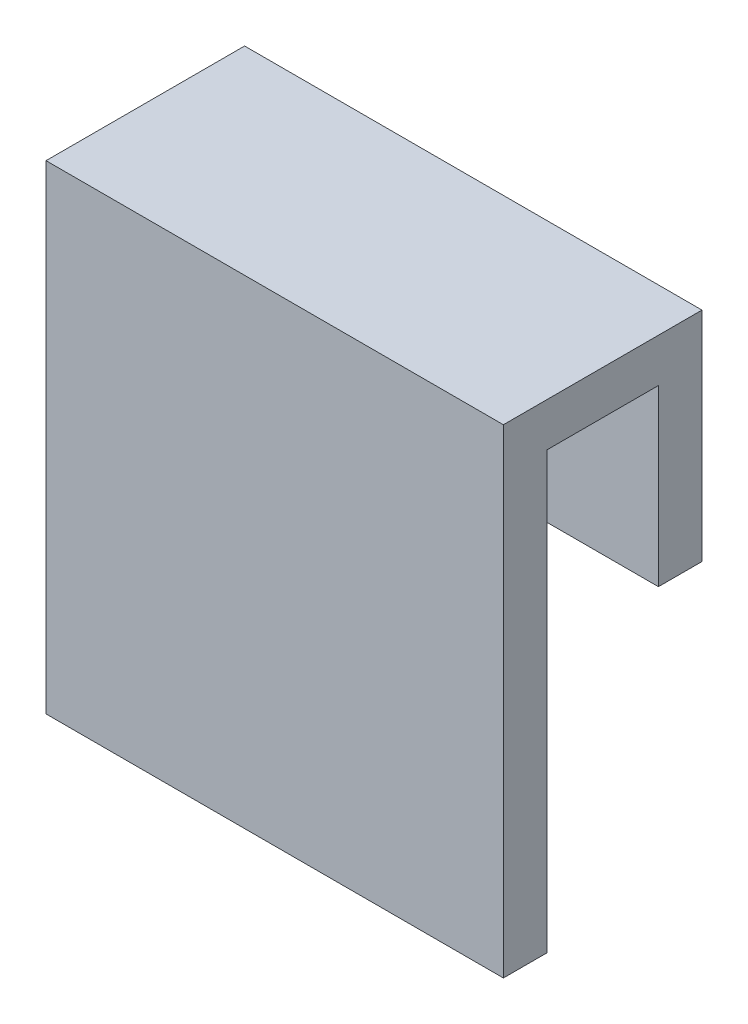
ISO-10303-21;
HEADER;
FILE_DESCRIPTION(('STEP AP214'),'2;1');
FILE_NAME('part.step','',(''),(''),'','','');
FILE_SCHEMA(('AUTOMOTIVE_DESIGN { 1 0 10303 214 1 1 1 1 }'));
ENDSEC;
DATA;
#1=APPLICATION_CONTEXT('core data for automotive mechanical design processes');
#2=APPLICATION_PROTOCOL_DEFINITION('international standard','automotive_design',2000,#1);
#3=PRODUCT_CONTEXT('',#1,'mechanical');
#4=PRODUCT('Part','Part','',(#3));
#5=PRODUCT_RELATED_PRODUCT_CATEGORY('part','',(#4));
#6=PRODUCT_DEFINITION_FORMATION('','',#4);
#7=PRODUCT_DEFINITION_CONTEXT('part definition',#1,'design');
#8=PRODUCT_DEFINITION('design','',#6,#7);
#9=PRODUCT_DEFINITION_SHAPE('','',#8);
#10=(LENGTH_UNIT() NAMED_UNIT(*) SI_UNIT(.MILLI.,.METRE.));
#11=(NAMED_UNIT(*) PLANE_ANGLE_UNIT() SI_UNIT($,.RADIAN.));
#12=(NAMED_UNIT(*) SI_UNIT($,.STERADIAN.) SOLID_ANGLE_UNIT());
#13=UNCERTAINTY_MEASURE_WITH_UNIT(LENGTH_MEASURE(1.E-05),#10,'distance_accuracy_value','');
#14=(GEOMETRIC_REPRESENTATION_CONTEXT(3) GLOBAL_UNCERTAINTY_ASSIGNED_CONTEXT((#13)) GLOBAL_UNIT_ASSIGNED_CONTEXT((#10,
#11,#12)) REPRESENTATION_CONTEXT('',''));
#15=CARTESIAN_POINT('',(0.,0.,0.));
#16=DIRECTION('',(0.,0.,1.));
#17=DIRECTION('',(1.,0.,0.));
#18=AXIS2_PLACEMENT_3D('',#15,#16,#17);
#19=CARTESIAN_POINT('',(53.34,45.4099471248672,6.37455993171156));
#20=DIRECTION('',(0.,0.,1.));
#21=DIRECTION('',(0.,-1.,0.));
#22=AXIS2_PLACEMENT_3D('',#19,#20,#21);
#23=PLANE('',#22);
#24=DIRECTION('',(0.,1.,0.));
#25=VECTOR('',#24,1.);
#26=CARTESIAN_POINT('',(0.,45.4099471248672,6.37455993171156));
#27=LINE('',#26,#25);
#28=CARTESIAN_POINT('',(0.,-5.39005287513277,6.37455993171155));
#29=VERTEX_POINT('',#28);
#30=CARTESIAN_POINT('',(0.,45.4099471248672,6.37455993171156));
#31=VERTEX_POINT('',#30);
#32=EDGE_CURVE('E140',#29,#31,#27,.T.);
#33=ORIENTED_EDGE('',*,*,#32,.T.);
#34=DIRECTION('',(-1.,0.,0.));
#35=VECTOR('',#34,1.);
#36=CARTESIAN_POINT('',(53.34,45.4099471248672,6.37455993171156));
#37=LINE('',#36,#35);
#38=CARTESIAN_POINT('',(53.34,45.4099471248672,6.37455993171156));
#39=VERTEX_POINT('',#38);
#40=EDGE_CURVE('E11',#39,#31,#37,.T.);
#41=ORIENTED_EDGE('',*,*,#40,.F.);
#42=DIRECTION('',(0.,1.,0.));
#43=VECTOR('',#42,1.);
#44=CARTESIAN_POINT('',(53.34,45.4099471248672,6.37455993171156));
#45=LINE('',#44,#43);
#46=CARTESIAN_POINT('',(53.34,-5.39005287513277,6.37455993171155));
#47=VERTEX_POINT('',#46);
#48=EDGE_CURVE('E162',#47,#39,#45,.T.);
#49=ORIENTED_EDGE('',*,*,#48,.F.);
#50=DIRECTION('',(-1.,0.,0.));
#51=VECTOR('',#50,1.);
#52=CARTESIAN_POINT('',(53.34,-5.39005287513277,6.37455993171155));
#53=LINE('',#52,#51);
#54=EDGE_CURVE('E136',#47,#29,#53,.T.);
#55=ORIENTED_EDGE('',*,*,#54,.T.);
#56=EDGE_LOOP('',(#33,#41,#49,#55));
#57=FACE_BOUND('',#56,.T.);
#58=ADVANCED_FACE('F39',(#57),#23,.F.);
#59=CARTESIAN_POINT('',(53.34,45.4099471248672,6.37455993171156));
#60=DIRECTION('',(0.,1.,0.));
#61=DIRECTION('',(0.,0.,1.));
#62=AXIS2_PLACEMENT_3D('',#59,#60,#61);
#63=PLANE('',#62);
#64=DIRECTION('',(0.,0.,-1.));
#65=VECTOR('',#64,1.);
#66=CARTESIAN_POINT('',(0.,45.4099471248672,6.37455993171156));
#67=LINE('',#66,#65);
#68=CARTESIAN_POINT('',(0.,45.4099471248672,-6.62544006828845));
#69=VERTEX_POINT('',#68);
#70=EDGE_CURVE('E144',#31,#69,#67,.T.);
#71=ORIENTED_EDGE('',*,*,#70,.T.);
#72=DIRECTION('',(-1.,0.,0.));
#73=VECTOR('',#72,1.);
#74=CARTESIAN_POINT('',(53.34,45.4099471248672,-6.62544006828845));
#75=LINE('',#74,#73);
#76=CARTESIAN_POINT('',(53.34,45.4099471248672,-6.62544006828845));
#77=VERTEX_POINT('',#76);
#78=EDGE_CURVE('E48',#77,#69,#75,.T.);
#79=ORIENTED_EDGE('',*,*,#78,.F.);
#80=DIRECTION('',(0.,0.,-1.));
#81=VECTOR('',#80,1.);
#82=CARTESIAN_POINT('',(53.34,45.4099471248672,6.37455993171156));
#83=LINE('',#82,#81);
#84=EDGE_CURVE('E99',#39,#77,#83,.T.);
#85=ORIENTED_EDGE('',*,*,#84,.F.);
#86=ORIENTED_EDGE('',*,*,#40,.T.);
#87=EDGE_LOOP('',(#71,#79,#85,#86));
#88=FACE_BOUND('',#87,.T.);
#89=ADVANCED_FACE('F208',(#88),#63,.F.);
#90=CARTESIAN_POINT('',(53.34,45.4099471248672,-6.62544006828845));
#91=DIRECTION('',(0.,0.,-1.));
#92=DIRECTION('',(0.,1.,0.));
#93=AXIS2_PLACEMENT_3D('',#90,#91,#92);
#94=PLANE('',#93);
#95=DIRECTION('',(0.,-1.,0.));
#96=VECTOR('',#95,1.);
#97=CARTESIAN_POINT('',(0.,45.4099471248672,-6.62544006828845));
#98=LINE('',#97,#96);
#99=CARTESIAN_POINT('',(0.,25.0899471248672,-6.62544006828845));
#100=VERTEX_POINT('',#99);
#101=EDGE_CURVE('E147',#69,#100,#98,.T.);
#102=ORIENTED_EDGE('',*,*,#101,.T.);
#103=DIRECTION('',(-1.,0.,0.));
#104=VECTOR('',#103,1.);
#105=CARTESIAN_POINT('',(53.34,25.0899471248672,-6.62544006828845));
#106=LINE('',#105,#104);
#107=CARTESIAN_POINT('',(53.34,25.0899471248672,-6.62544006828845));
#108=VERTEX_POINT('',#107);
#109=EDGE_CURVE('E173',#108,#100,#106,.T.);
#110=ORIENTED_EDGE('',*,*,#109,.F.);
#111=DIRECTION('',(0.,-1.,0.));
#112=VECTOR('',#111,1.);
#113=CARTESIAN_POINT('',(53.34,45.4099471248672,-6.62544006828845));
#114=LINE('',#113,#112);
#115=EDGE_CURVE('E183',#77,#108,#114,.T.);
#116=ORIENTED_EDGE('',*,*,#115,.F.);
#117=ORIENTED_EDGE('',*,*,#78,.T.);
#118=EDGE_LOOP('',(#102,#110,#116,#117));
#119=FACE_BOUND('',#118,.T.);
#120=ADVANCED_FACE('F181',(#119),#94,.F.);
#121=CARTESIAN_POINT('',(53.34,25.0899471248672,-6.62544006828845));
#122=DIRECTION('',(0.,1.,0.));
#123=DIRECTION('',(0.,0.,1.));
#124=AXIS2_PLACEMENT_3D('',#121,#122,#123);
#125=PLANE('',#124);
#126=DIRECTION('',(0.,0.,-1.));
#127=VECTOR('',#126,1.);
#128=CARTESIAN_POINT('',(0.,25.0899471248672,-6.62544006828845));
#129=LINE('',#128,#127);
#130=CARTESIAN_POINT('',(0.,25.0899471248672,-11.7054400682885));
#131=VERTEX_POINT('',#130);
#132=EDGE_CURVE('E150',#100,#131,#129,.T.);
#133=ORIENTED_EDGE('',*,*,#132,.T.);
#134=DIRECTION('',(-1.,0.,0.));
#135=VECTOR('',#134,1.);
#136=CARTESIAN_POINT('',(53.34,25.0899471248672,-11.7054400682885));
#137=LINE('',#136,#135);
#138=CARTESIAN_POINT('',(53.34,25.0899471248672,-11.7054400682885));
#139=VERTEX_POINT('',#138);
#140=EDGE_CURVE('E169',#139,#131,#137,.T.);
#141=ORIENTED_EDGE('',*,*,#140,.F.);
#142=DIRECTION('',(0.,0.,-1.));
#143=VECTOR('',#142,1.);
#144=CARTESIAN_POINT('',(53.34,25.0899471248672,-6.62544006828845));
#145=LINE('',#144,#143);
#146=EDGE_CURVE('E196',#108,#139,#145,.T.);
#147=ORIENTED_EDGE('',*,*,#146,.F.);
#148=ORIENTED_EDGE('',*,*,#109,.T.);
#149=EDGE_LOOP('',(#133,#141,#147,#148));
#150=FACE_BOUND('',#149,.T.);
#151=ADVANCED_FACE('F191',(#150),#125,.F.);
#152=CARTESIAN_POINT('',(53.34,25.0899471248672,-11.7054400682885));
#153=DIRECTION('',(0.,0.,1.));
#154=DIRECTION('',(0.,-1.,0.));
#155=AXIS2_PLACEMENT_3D('',#152,#153,#154);
#156=PLANE('',#155);
#157=DIRECTION('',(0.,1.,0.));
#158=VECTOR('',#157,1.);
#159=CARTESIAN_POINT('',(0.,25.0899471248672,-11.7054400682885));
#160=LINE('',#159,#158);
#161=CARTESIAN_POINT('',(0.,50.4899471248672,-11.7054400682884));
#162=VERTEX_POINT('',#161);
#163=EDGE_CURVE('E153',#131,#162,#160,.T.);
#164=ORIENTED_EDGE('',*,*,#163,.T.);
#165=DIRECTION('',(-1.,0.,0.));
#166=VECTOR('',#165,1.);
#167=CARTESIAN_POINT('',(53.34,50.4899471248672,-11.7054400682884));
#168=LINE('',#167,#166);
#169=CARTESIAN_POINT('',(53.34,50.4899471248672,-11.7054400682884));
#170=VERTEX_POINT('',#169);
#171=EDGE_CURVE('E129',#170,#162,#168,.T.);
#172=ORIENTED_EDGE('',*,*,#171,.F.);
#173=DIRECTION('',(0.,1.,0.));
#174=VECTOR('',#173,1.);
#175=CARTESIAN_POINT('',(53.34,25.0899471248672,-11.7054400682885));
#176=LINE('',#175,#174);
#177=EDGE_CURVE('E118',#139,#170,#176,.T.);
#178=ORIENTED_EDGE('',*,*,#177,.F.);
#179=ORIENTED_EDGE('',*,*,#140,.T.);
#180=EDGE_LOOP('',(#164,#172,#178,#179));
#181=FACE_BOUND('',#180,.T.);
#182=ADVANCED_FACE('F194',(#181),#156,.F.);
#183=CARTESIAN_POINT('',(53.34,50.4899471248672,-11.7054400682884));
#184=DIRECTION('',(0.,-1.,0.));
#185=DIRECTION('',(0.,0.,-1.));
#186=AXIS2_PLACEMENT_3D('',#183,#184,#185);
#187=PLANE('',#186);
#188=DIRECTION('',(0.,0.,1.));
#189=VECTOR('',#188,1.);
#190=CARTESIAN_POINT('',(0.,50.4899471248672,-11.7054400682884));
#191=LINE('',#190,#189);
#192=CARTESIAN_POINT('',(0.,50.4899471248672,11.4545599317116));
#193=VERTEX_POINT('',#192);
#194=EDGE_CURVE('E127',#162,#193,#191,.T.);
#195=ORIENTED_EDGE('',*,*,#194,.T.);
#196=DIRECTION('',(-1.,0.,0.));
#197=VECTOR('',#196,1.);
#198=CARTESIAN_POINT('',(53.34,50.4899471248672,11.4545599317116));
#199=LINE('',#198,#197);
#200=CARTESIAN_POINT('',(53.34,50.4899471248672,11.4545599317116));
#201=VERTEX_POINT('',#200);
#202=EDGE_CURVE('E124',#201,#193,#199,.T.);
#203=ORIENTED_EDGE('',*,*,#202,.F.);
#204=DIRECTION('',(0.,0.,1.));
#205=VECTOR('',#204,1.);
#206=CARTESIAN_POINT('',(53.34,50.4899471248672,-11.7054400682884));
#207=LINE('',#206,#205);
#208=EDGE_CURVE('E112',#170,#201,#207,.T.);
#209=ORIENTED_EDGE('',*,*,#208,.F.);
#210=ORIENTED_EDGE('',*,*,#171,.T.);
#211=EDGE_LOOP('',(#195,#203,#209,#210));
#212=FACE_BOUND('',#211,.T.);
#213=ADVANCED_FACE('F125',(#212),#187,.F.);
#214=CARTESIAN_POINT('',(53.34,50.4899471248672,11.4545599317116));
#215=DIRECTION('',(0.,0.,-1.));
#216=DIRECTION('',(0.,1.,0.));
#217=AXIS2_PLACEMENT_3D('',#214,#215,#216);
#218=PLANE('',#217);
#219=DIRECTION('',(0.,-1.,0.));
#220=VECTOR('',#219,1.);
#221=CARTESIAN_POINT('',(0.,50.4899471248672,11.4545599317116));
#222=LINE('',#221,#220);
#223=CARTESIAN_POINT('',(0.,-5.39005287513277,11.4545599317116));
#224=VERTEX_POINT('',#223);
#225=EDGE_CURVE('E85',#193,#224,#222,.T.);
#226=ORIENTED_EDGE('',*,*,#225,.T.);
#227=DIRECTION('',(-1.,0.,0.));
#228=VECTOR('',#227,1.);
#229=CARTESIAN_POINT('',(53.34,-5.39005287513277,11.4545599317116));
#230=LINE('',#229,#228);
#231=CARTESIAN_POINT('',(53.34,-5.39005287513277,11.4545599317116));
#232=VERTEX_POINT('',#231);
#233=EDGE_CURVE('E130',#232,#224,#230,.T.);
#234=ORIENTED_EDGE('',*,*,#233,.F.);
#235=DIRECTION('',(0.,-1.,0.));
#236=VECTOR('',#235,1.);
#237=CARTESIAN_POINT('',(53.34,50.4899471248672,11.4545599317116));
#238=LINE('',#237,#236);
#239=EDGE_CURVE('E116',#201,#232,#238,.T.);
#240=ORIENTED_EDGE('',*,*,#239,.F.);
#241=ORIENTED_EDGE('',*,*,#202,.T.);
#242=EDGE_LOOP('',(#226,#234,#240,#241));
#243=FACE_BOUND('',#242,.T.);
#244=ADVANCED_FACE('F132',(#243),#218,.F.);
#245=CARTESIAN_POINT('',(53.34,-5.39005287513277,6.37455993171155));
#246=DIRECTION('',(0.,1.,0.));
#247=DIRECTION('',(0.,0.,1.));
#248=AXIS2_PLACEMENT_3D('',#245,#246,#247);
#249=PLANE('',#248);
#250=DIRECTION('',(0.,0.,-1.));
#251=VECTOR('',#250,1.);
#252=CARTESIAN_POINT('',(0.,-5.39005287513277,6.37455993171155));
#253=LINE('',#252,#251);
#254=EDGE_CURVE('E91',#224,#29,#253,.T.);
#255=ORIENTED_EDGE('',*,*,#254,.T.);
#256=ORIENTED_EDGE('',*,*,#54,.F.);
#257=DIRECTION('',(0.,0.,-1.));
#258=VECTOR('',#257,1.);
#259=CARTESIAN_POINT('',(53.34,-5.39005287513277,6.37455993171155));
#260=LINE('',#259,#258);
#261=EDGE_CURVE('E56',#232,#47,#260,.T.);
#262=ORIENTED_EDGE('',*,*,#261,.F.);
#263=ORIENTED_EDGE('',*,*,#233,.T.);
#264=EDGE_LOOP('',(#255,#256,#262,#263));
#265=FACE_BOUND('',#264,.T.);
#266=ADVANCED_FACE('F224',(#265),#249,.F.);
#267=CARTESIAN_POINT('',(53.34,0.,0.));
#268=DIRECTION('',(-1.,0.,0.));
#269=DIRECTION('',(0.,0.,1.));
#270=AXIS2_PLACEMENT_3D('',#267,#268,#269);
#271=PLANE('',#270);
#272=ORIENTED_EDGE('',*,*,#48,.T.);
#273=ORIENTED_EDGE('',*,*,#84,.T.);
#274=ORIENTED_EDGE('',*,*,#115,.T.);
#275=ORIENTED_EDGE('',*,*,#146,.T.);
#276=ORIENTED_EDGE('',*,*,#177,.T.);
#277=ORIENTED_EDGE('',*,*,#208,.T.);
#278=ORIENTED_EDGE('',*,*,#239,.T.);
#279=ORIENTED_EDGE('',*,*,#261,.T.);
#280=EDGE_LOOP('',(#272,#273,#274,#275,#276,#277,#278,#279));
#281=FACE_BOUND('',#280,.T.);
#282=ADVANCED_FACE('F114',(#281),#271,.F.);
#283=CARTESIAN_POINT('',(0.,0.,0.));
#284=DIRECTION('',(-1.,0.,0.));
#285=DIRECTION('',(0.,0.,1.));
#286=AXIS2_PLACEMENT_3D('',#283,#284,#285);
#287=PLANE('',#286);
#288=ORIENTED_EDGE('',*,*,#32,.F.);
#289=ORIENTED_EDGE('',*,*,#254,.F.);
#290=ORIENTED_EDGE('',*,*,#225,.F.);
#291=ORIENTED_EDGE('',*,*,#194,.F.);
#292=ORIENTED_EDGE('',*,*,#163,.F.);
#293=ORIENTED_EDGE('',*,*,#132,.F.);
#294=ORIENTED_EDGE('',*,*,#101,.F.);
#295=ORIENTED_EDGE('',*,*,#70,.F.);
#296=EDGE_LOOP('',(#288,#289,#290,#291,#292,#293,#294,#295));
#297=FACE_BOUND('',#296,.T.);
#298=ADVANCED_FACE('F187',(#297),#287,.T.);
#299=CLOSED_SHELL('',(#58,#89,#120,#151,#182,#213,#244,#266,#282,#298));
#300=MANIFOLD_SOLID_BREP('B2',#299);
#301=ADVANCED_BREP_SHAPE_REPRESENTATION('',(#18,#300),#14);
#302=SHAPE_DEFINITION_REPRESENTATION(#9,#301);
ENDSEC;
END-ISO-10303-21;
